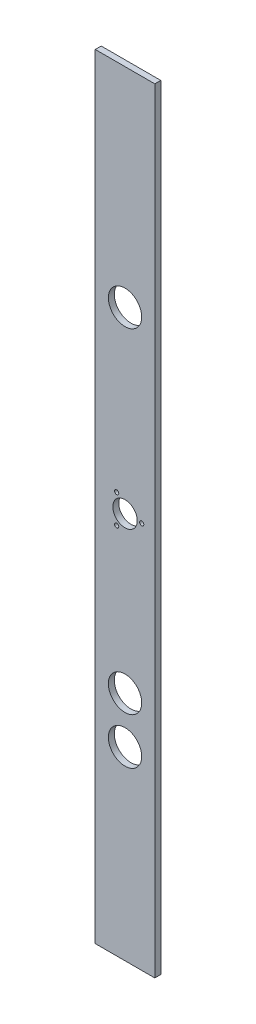
ISO-10303-21;
HEADER;
FILE_DESCRIPTION(('STEP AP214'),'2;1');
FILE_NAME('part.step','',(''),(''),'','','');
FILE_SCHEMA(('AUTOMOTIVE_DESIGN { 1 0 10303 214 1 1 1 1 }'));
ENDSEC;
DATA;
#1=APPLICATION_CONTEXT('core data for automotive mechanical design processes');
#2=APPLICATION_PROTOCOL_DEFINITION('international standard','automotive_design',2000,#1);
#3=PRODUCT_CONTEXT('',#1,'mechanical');
#4=PRODUCT('Part','Part','',(#3));
#5=PRODUCT_RELATED_PRODUCT_CATEGORY('part','',(#4));
#6=PRODUCT_DEFINITION_FORMATION('','',#4);
#7=PRODUCT_DEFINITION_CONTEXT('part definition',#1,'design');
#8=PRODUCT_DEFINITION('design','',#6,#7);
#9=PRODUCT_DEFINITION_SHAPE('','',#8);
#10=(LENGTH_UNIT() NAMED_UNIT(*) SI_UNIT(.MILLI.,.METRE.));
#11=(NAMED_UNIT(*) PLANE_ANGLE_UNIT() SI_UNIT($,.RADIAN.));
#12=(NAMED_UNIT(*) SI_UNIT($,.STERADIAN.) SOLID_ANGLE_UNIT());
#13=UNCERTAINTY_MEASURE_WITH_UNIT(LENGTH_MEASURE(1.E-05),#10,'distance_accuracy_value','');
#14=(GEOMETRIC_REPRESENTATION_CONTEXT(3) GLOBAL_UNCERTAINTY_ASSIGNED_CONTEXT((#13)) GLOBAL_UNIT_ASSIGNED_CONTEXT((#10,
#11,#12)) REPRESENTATION_CONTEXT('',''));
#15=CARTESIAN_POINT('',(0.,0.,0.));
#16=DIRECTION('',(0.,0.,1.));
#17=DIRECTION('',(1.,0.,0.));
#18=AXIS2_PLACEMENT_3D('',#15,#16,#17);
#19=CARTESIAN_POINT('',(50.,0.,5.));
#20=DIRECTION('',(1.,0.,0.));
#21=DIRECTION('',(0.,1.,0.));
#22=AXIS2_PLACEMENT_3D('',#19,#20,#21);
#23=PLANE('',#22);
#24=DIRECTION('',(0.,-1.,0.));
#25=VECTOR('',#24,1.);
#26=CARTESIAN_POINT('',(50.,0.,0.));
#27=LINE('',#26,#25);
#28=CARTESIAN_POINT('',(50.,0.,0.));
#29=VERTEX_POINT('',#28);
#30=CARTESIAN_POINT('',(50.0000000000001,-650.,0.));
#31=VERTEX_POINT('',#30);
#32=EDGE_CURVE('E118',#29,#31,#27,.T.);
#33=ORIENTED_EDGE('',*,*,#32,.F.);
#34=DIRECTION('',(0.,0.,-1.));
#35=VECTOR('',#34,1.);
#36=CARTESIAN_POINT('',(50.,0.,5.));
#37=LINE('',#36,#35);
#38=CARTESIAN_POINT('',(50.,0.,5.));
#39=VERTEX_POINT('',#38);
#40=EDGE_CURVE('E78',#39,#29,#37,.T.);
#41=ORIENTED_EDGE('',*,*,#40,.F.);
#42=DIRECTION('',(0.,-1.,0.));
#43=VECTOR('',#42,1.);
#44=CARTESIAN_POINT('',(50.,0.,5.));
#45=LINE('',#44,#43);
#46=CARTESIAN_POINT('',(50.0000000000001,-650.,5.));
#47=VERTEX_POINT('',#46);
#48=EDGE_CURVE('E99',#39,#47,#45,.T.);
#49=ORIENTED_EDGE('',*,*,#48,.T.);
#50=DIRECTION('',(0.,0.,-1.));
#51=VECTOR('',#50,1.);
#52=CARTESIAN_POINT('',(50.0000000000001,-650.,5.));
#53=LINE('',#52,#51);
#54=EDGE_CURVE('E75',#47,#31,#53,.T.);
#55=ORIENTED_EDGE('',*,*,#54,.T.);
#56=EDGE_LOOP('',(#33,#41,#49,#55));
#57=FACE_BOUND('',#56,.T.);
#58=ADVANCED_FACE('F34',(#57),#23,.T.);
#59=CARTESIAN_POINT('',(0.,0.,5.));
#60=DIRECTION('',(0.,1.,0.));
#61=DIRECTION('',(0.,0.,1.));
#62=AXIS2_PLACEMENT_3D('',#59,#60,#61);
#63=PLANE('',#62);
#64=DIRECTION('',(1.,0.,0.));
#65=VECTOR('',#64,1.);
#66=CARTESIAN_POINT('',(0.,0.,0.));
#67=LINE('',#66,#65);
#68=CARTESIAN_POINT('',(0.,0.,0.));
#69=VERTEX_POINT('',#68);
#70=EDGE_CURVE('E89',#69,#29,#67,.T.);
#71=ORIENTED_EDGE('',*,*,#70,.F.);
#72=DIRECTION('',(0.,0.,-1.));
#73=VECTOR('',#72,1.);
#74=CARTESIAN_POINT('',(0.,0.,5.));
#75=LINE('',#74,#73);
#76=CARTESIAN_POINT('',(0.,0.,5.));
#77=VERTEX_POINT('',#76);
#78=EDGE_CURVE('E83',#77,#69,#75,.T.);
#79=ORIENTED_EDGE('',*,*,#78,.F.);
#80=DIRECTION('',(1.,0.,0.));
#81=VECTOR('',#80,1.);
#82=CARTESIAN_POINT('',(0.,0.,5.));
#83=LINE('',#82,#81);
#84=EDGE_CURVE('E87',#77,#39,#83,.T.);
#85=ORIENTED_EDGE('',*,*,#84,.T.);
#86=ORIENTED_EDGE('',*,*,#40,.T.);
#87=EDGE_LOOP('',(#71,#79,#85,#86));
#88=FACE_BOUND('',#87,.T.);
#89=ADVANCED_FACE('F85',(#88),#63,.T.);
#90=CARTESIAN_POINT('',(0.,0.,5.));
#91=DIRECTION('',(1.,0.,0.));
#92=DIRECTION('',(0.,1.,0.));
#93=AXIS2_PLACEMENT_3D('',#90,#91,#92);
#94=PLANE('',#93);
#95=DIRECTION('',(0.,-1.,0.));
#96=VECTOR('',#95,1.);
#97=CARTESIAN_POINT('',(0.,0.,0.));
#98=LINE('',#97,#96);
#99=CARTESIAN_POINT('',(0.,-650.,0.));
#100=VERTEX_POINT('',#99);
#101=EDGE_CURVE('E121',#69,#100,#98,.T.);
#102=ORIENTED_EDGE('',*,*,#101,.T.);
#103=DIRECTION('',(0.,0.,-1.));
#104=VECTOR('',#103,1.);
#105=CARTESIAN_POINT('',(0.,-650.,5.));
#106=LINE('',#105,#104);
#107=CARTESIAN_POINT('',(0.,-650.,5.));
#108=VERTEX_POINT('',#107);
#109=EDGE_CURVE('E92',#108,#100,#106,.T.);
#110=ORIENTED_EDGE('',*,*,#109,.F.);
#111=DIRECTION('',(0.,-1.,0.));
#112=VECTOR('',#111,1.);
#113=CARTESIAN_POINT('',(0.,0.,5.));
#114=LINE('',#113,#112);
#115=EDGE_CURVE('E95',#77,#108,#114,.T.);
#116=ORIENTED_EDGE('',*,*,#115,.F.);
#117=ORIENTED_EDGE('',*,*,#78,.T.);
#118=EDGE_LOOP('',(#102,#110,#116,#117));
#119=FACE_BOUND('',#118,.T.);
#120=ADVANCED_FACE('F96',(#119),#94,.F.);
#121=CARTESIAN_POINT('',(25.,-494.5,5.));
#122=DIRECTION('',(0.,0.,-1.));
#123=DIRECTION('',(-1.,0.,0.));
#124=AXIS2_PLACEMENT_3D('',#121,#122,#123);
#125=CYLINDRICAL_SURFACE('',#124,14.);
#126=CARTESIAN_POINT('',(25.,-494.5,5.));
#127=DIRECTION('',(0.,0.,1.));
#128=DIRECTION('',(1.,0.,0.));
#129=AXIS2_PLACEMENT_3D('',#126,#127,#128);
#130=CIRCLE('',#129,14.);
#131=CARTESIAN_POINT('',(39.,-494.5,5.));
#132=VERTEX_POINT('',#131);
#133=EDGE_CURVE('E101',#132,#132,#130,.T.);
#134=ORIENTED_EDGE('',*,*,#133,.T.);
#135=EDGE_LOOP('',(#134));
#136=FACE_BOUND('',#135,.T.);
#137=CARTESIAN_POINT('',(25.,-494.5,0.));
#138=DIRECTION('',(0.,0.,1.));
#139=DIRECTION('',(1.,0.,0.));
#140=AXIS2_PLACEMENT_3D('',#137,#138,#139);
#141=CIRCLE('',#140,14.);
#142=CARTESIAN_POINT('',(39.,-494.5,0.));
#143=VERTEX_POINT('',#142);
#144=EDGE_CURVE('E115',#143,#143,#141,.T.);
#145=ORIENTED_EDGE('',*,*,#144,.F.);
#146=EDGE_LOOP('',(#145));
#147=FACE_BOUND('',#146,.T.);
#148=ADVANCED_FACE('F173',(#136,#147),#125,.F.);
#149=CARTESIAN_POINT('',(18.,-312.875644347018,5.));
#150=DIRECTION('',(0.,0.,-1.));
#151=DIRECTION('',(-1.,0.,0.));
#152=AXIS2_PLACEMENT_3D('',#149,#150,#151);
#153=CYLINDRICAL_SURFACE('',#152,1.75000000000001);
#154=CARTESIAN_POINT('',(18.,-312.875644347018,1.00000000000001));
#155=DIRECTION('',(0.,0.,1.));
#156=DIRECTION('',(1.,0.,0.));
#157=AXIS2_PLACEMENT_3D('',#154,#155,#156);
#158=CIRCLE('',#157,1.75000000000001);
#159=CARTESIAN_POINT('',(19.75,-312.875644347018,1.00000000000001));
#160=VERTEX_POINT('',#159);
#161=EDGE_CURVE('E43',#160,#160,#158,.F.);
#162=ORIENTED_EDGE('',*,*,#161,.T.);
#163=EDGE_LOOP('',(#162));
#164=FACE_BOUND('',#163,.T.);
#165=CARTESIAN_POINT('',(18.,-312.875644347018,5.));
#166=DIRECTION('',(0.,0.,1.));
#167=DIRECTION('',(1.,0.,0.));
#168=AXIS2_PLACEMENT_3D('',#165,#166,#167);
#169=CIRCLE('',#168,1.75000000000001);
#170=CARTESIAN_POINT('',(19.75,-312.875644347018,5.));
#171=VERTEX_POINT('',#170);
#172=EDGE_CURVE('E225',#171,#171,#169,.T.);
#173=ORIENTED_EDGE('',*,*,#172,.T.);
#174=EDGE_LOOP('',(#173));
#175=FACE_BOUND('',#174,.T.);
#176=ADVANCED_FACE('F142',(#164,#175),#153,.F.);
#177=CARTESIAN_POINT('',(25.,-455.5,5.));
#178=DIRECTION('',(0.,0.,-1.));
#179=DIRECTION('',(-1.,0.,0.));
#180=AXIS2_PLACEMENT_3D('',#177,#178,#179);
#181=CYLINDRICAL_SURFACE('',#180,14.);
#182=CARTESIAN_POINT('',(25.,-455.5,5.));
#183=DIRECTION('',(0.,0.,1.));
#184=DIRECTION('',(1.,0.,0.));
#185=AXIS2_PLACEMENT_3D('',#182,#183,#184);
#186=CIRCLE('',#185,14.);
#187=CARTESIAN_POINT('',(39.0000000000001,-455.5,5.));
#188=VERTEX_POINT('',#187);
#189=EDGE_CURVE('E222',#188,#188,#186,.T.);
#190=ORIENTED_EDGE('',*,*,#189,.T.);
#191=EDGE_LOOP('',(#190));
#192=FACE_BOUND('',#191,.T.);
#193=CARTESIAN_POINT('',(25.,-455.5,0.));
#194=DIRECTION('',(0.,0.,1.));
#195=DIRECTION('',(1.,0.,0.));
#196=AXIS2_PLACEMENT_3D('',#193,#194,#195);
#197=CIRCLE('',#196,14.);
#198=CARTESIAN_POINT('',(39.0000000000001,-455.5,0.));
#199=VERTEX_POINT('',#198);
#200=EDGE_CURVE('E112',#199,#199,#197,.T.);
#201=ORIENTED_EDGE('',*,*,#200,.F.);
#202=EDGE_LOOP('',(#201));
#203=FACE_BOUND('',#202,.T.);
#204=ADVANCED_FACE('F179',(#192,#203),#181,.F.);
#205=CARTESIAN_POINT('',(25.,-175.,5.));
#206=DIRECTION('',(0.,0.,-1.));
#207=DIRECTION('',(-1.,0.,0.));
#208=AXIS2_PLACEMENT_3D('',#205,#206,#207);
#209=CYLINDRICAL_SURFACE('',#208,14.);
#210=CARTESIAN_POINT('',(25.,-175.,5.));
#211=DIRECTION('',(0.,0.,1.));
#212=DIRECTION('',(1.,0.,0.));
#213=AXIS2_PLACEMENT_3D('',#210,#211,#212);
#214=CIRCLE('',#213,14.);
#215=CARTESIAN_POINT('',(39.0000000000001,-175.,5.));
#216=VERTEX_POINT('',#215);
#217=EDGE_CURVE('E219',#216,#216,#214,.T.);
#218=ORIENTED_EDGE('',*,*,#217,.T.);
#219=EDGE_LOOP('',(#218));
#220=FACE_BOUND('',#219,.T.);
#221=CARTESIAN_POINT('',(25.,-175.,0.));
#222=DIRECTION('',(0.,0.,1.));
#223=DIRECTION('',(1.,0.,0.));
#224=AXIS2_PLACEMENT_3D('',#221,#222,#223);
#225=CIRCLE('',#224,14.);
#226=CARTESIAN_POINT('',(39.0000000000001,-175.,0.));
#227=VERTEX_POINT('',#226);
#228=EDGE_CURVE('E109',#227,#227,#225,.T.);
#229=ORIENTED_EDGE('',*,*,#228,.F.);
#230=EDGE_LOOP('',(#229));
#231=FACE_BOUND('',#230,.T.);
#232=ADVANCED_FACE('F182',(#220,#231),#209,.F.);
#233=CARTESIAN_POINT('',(39.,-325.,5.));
#234=DIRECTION('',(0.,0.,-1.));
#235=DIRECTION('',(-1.,0.,0.));
#236=AXIS2_PLACEMENT_3D('',#233,#234,#235);
#237=CYLINDRICAL_SURFACE('',#236,1.75000000000002);
#238=CARTESIAN_POINT('',(39.,-325.,1.00000000000005));
#239=DIRECTION('',(0.,0.,1.));
#240=DIRECTION('',(1.,0.,0.));
#241=AXIS2_PLACEMENT_3D('',#238,#239,#240);
#242=CIRCLE('',#241,1.75000000000002);
#243=CARTESIAN_POINT('',(40.7500000000001,-325.,1.00000000000005));
#244=VERTEX_POINT('',#243);
#245=EDGE_CURVE('E11',#244,#244,#242,.F.);
#246=ORIENTED_EDGE('',*,*,#245,.T.);
#247=EDGE_LOOP('',(#246));
#248=FACE_BOUND('',#247,.T.);
#249=CARTESIAN_POINT('',(39.,-325.,5.));
#250=DIRECTION('',(0.,0.,1.));
#251=DIRECTION('',(1.,0.,0.));
#252=AXIS2_PLACEMENT_3D('',#249,#250,#251);
#253=CIRCLE('',#252,1.75000000000002);
#254=CARTESIAN_POINT('',(40.7500000000001,-325.,5.));
#255=VERTEX_POINT('',#254);
#256=EDGE_CURVE('E214',#255,#255,#253,.T.);
#257=ORIENTED_EDGE('',*,*,#256,.T.);
#258=EDGE_LOOP('',(#257));
#259=FACE_BOUND('',#258,.T.);
#260=ADVANCED_FACE('F186',(#248,#259),#237,.F.);
#261=CARTESIAN_POINT('',(25.,-325.,5.));
#262=DIRECTION('',(0.,0.,-1.));
#263=DIRECTION('',(-1.,0.,0.));
#264=AXIS2_PLACEMENT_3D('',#261,#262,#263);
#265=CYLINDRICAL_SURFACE('',#264,10.25);
#266=CARTESIAN_POINT('',(25.,-325.,5.));
#267=DIRECTION('',(0.,0.,1.));
#268=DIRECTION('',(1.,0.,0.));
#269=AXIS2_PLACEMENT_3D('',#266,#267,#268);
#270=CIRCLE('',#269,10.25);
#271=CARTESIAN_POINT('',(35.25,-325.,5.));
#272=VERTEX_POINT('',#271);
#273=EDGE_CURVE('E211',#272,#272,#270,.T.);
#274=ORIENTED_EDGE('',*,*,#273,.T.);
#275=EDGE_LOOP('',(#274));
#276=FACE_BOUND('',#275,.T.);
#277=CARTESIAN_POINT('',(25.,-325.,0.));
#278=DIRECTION('',(0.,0.,1.));
#279=DIRECTION('',(1.,0.,0.));
#280=AXIS2_PLACEMENT_3D('',#277,#278,#279);
#281=CIRCLE('',#280,10.25);
#282=CARTESIAN_POINT('',(35.25,-325.,0.));
#283=VERTEX_POINT('',#282);
#284=EDGE_CURVE('E106',#283,#283,#281,.T.);
#285=ORIENTED_EDGE('',*,*,#284,.F.);
#286=EDGE_LOOP('',(#285));
#287=FACE_BOUND('',#286,.T.);
#288=ADVANCED_FACE('F190',(#276,#287),#265,.F.);
#289=CARTESIAN_POINT('',(18.,-337.124355652982,5.));
#290=DIRECTION('',(0.,0.,-1.));
#291=DIRECTION('',(-1.,0.,0.));
#292=AXIS2_PLACEMENT_3D('',#289,#290,#291);
#293=CYLINDRICAL_SURFACE('',#292,1.75);
#294=CARTESIAN_POINT('',(18.,-337.124355652982,1.00000000000002));
#295=DIRECTION('',(0.,0.,1.));
#296=DIRECTION('',(1.,0.,0.));
#297=AXIS2_PLACEMENT_3D('',#294,#295,#296);
#298=CIRCLE('',#297,1.75);
#299=CARTESIAN_POINT('',(19.75,-337.124355652982,1.00000000000002));
#300=VERTEX_POINT('',#299);
#301=EDGE_CURVE('E137',#300,#300,#298,.F.);
#302=ORIENTED_EDGE('',*,*,#301,.T.);
#303=EDGE_LOOP('',(#302));
#304=FACE_BOUND('',#303,.T.);
#305=CARTESIAN_POINT('',(18.,-337.124355652982,5.));
#306=DIRECTION('',(0.,0.,1.));
#307=DIRECTION('',(1.,0.,0.));
#308=AXIS2_PLACEMENT_3D('',#305,#306,#307);
#309=CIRCLE('',#308,1.75);
#310=CARTESIAN_POINT('',(19.75,-337.124355652982,5.));
#311=VERTEX_POINT('',#310);
#312=EDGE_CURVE('E124',#311,#311,#309,.T.);
#313=ORIENTED_EDGE('',*,*,#312,.T.);
#314=EDGE_LOOP('',(#313));
#315=FACE_BOUND('',#314,.T.);
#316=ADVANCED_FACE('F194',(#304,#315),#293,.F.);
#317=CARTESIAN_POINT('',(0.,-650.,5.));
#318=DIRECTION('',(0.,1.,0.));
#319=DIRECTION('',(0.,0.,1.));
#320=AXIS2_PLACEMENT_3D('',#317,#318,#319);
#321=PLANE('',#320);
#322=DIRECTION('',(1.,0.,0.));
#323=VECTOR('',#322,1.);
#324=CARTESIAN_POINT('',(0.,-650.,0.));
#325=LINE('',#324,#323);
#326=EDGE_CURVE('E68',#100,#31,#325,.T.);
#327=ORIENTED_EDGE('',*,*,#326,.T.);
#328=ORIENTED_EDGE('',*,*,#54,.F.);
#329=DIRECTION('',(1.,0.,0.));
#330=VECTOR('',#329,1.);
#331=CARTESIAN_POINT('',(0.,-650.,5.));
#332=LINE('',#331,#330);
#333=EDGE_CURVE('E51',#108,#47,#332,.T.);
#334=ORIENTED_EDGE('',*,*,#333,.F.);
#335=ORIENTED_EDGE('',*,*,#109,.T.);
#336=EDGE_LOOP('',(#327,#328,#334,#335));
#337=FACE_BOUND('',#336,.T.);
#338=ADVANCED_FACE('F198',(#337),#321,.F.);
#339=CARTESIAN_POINT('',(0.,0.,5.));
#340=DIRECTION('',(0.,0.,1.));
#341=DIRECTION('',(1.,0.,0.));
#342=AXIS2_PLACEMENT_3D('',#339,#340,#341);
#343=PLANE('',#342);
#344=ORIENTED_EDGE('',*,*,#312,.F.);
#345=EDGE_LOOP('',(#344));
#346=FACE_BOUND('',#345,.T.);
#347=ORIENTED_EDGE('',*,*,#273,.F.);
#348=EDGE_LOOP('',(#347));
#349=FACE_BOUND('',#348,.T.);
#350=ORIENTED_EDGE('',*,*,#256,.F.);
#351=EDGE_LOOP('',(#350));
#352=FACE_BOUND('',#351,.T.);
#353=ORIENTED_EDGE('',*,*,#217,.F.);
#354=EDGE_LOOP('',(#353));
#355=FACE_BOUND('',#354,.T.);
#356=ORIENTED_EDGE('',*,*,#189,.F.);
#357=EDGE_LOOP('',(#356));
#358=FACE_BOUND('',#357,.T.);
#359=ORIENTED_EDGE('',*,*,#172,.F.);
#360=EDGE_LOOP('',(#359));
#361=FACE_BOUND('',#360,.T.);
#362=ORIENTED_EDGE('',*,*,#133,.F.);
#363=EDGE_LOOP('',(#362));
#364=FACE_BOUND('',#363,.T.);
#365=ORIENTED_EDGE('',*,*,#48,.F.);
#366=ORIENTED_EDGE('',*,*,#84,.F.);
#367=ORIENTED_EDGE('',*,*,#115,.T.);
#368=ORIENTED_EDGE('',*,*,#333,.T.);
#369=EDGE_LOOP('',(#365,#366,#367,#368));
#370=FACE_BOUND('',#369,.T.);
#371=ADVANCED_FACE('F98',(#346,#349,#352,#355,#358,#361,#364,#370),#343,.T.);
#372=CARTESIAN_POINT('',(0.,0.,0.));
#373=DIRECTION('',(0.,0.,1.));
#374=DIRECTION('',(1.,0.,0.));
#375=AXIS2_PLACEMENT_3D('',#372,#373,#374);
#376=PLANE('',#375);
#377=CARTESIAN_POINT('',(18.,-337.124355652982,0.));
#378=DIRECTION('',(0.,0.,1.));
#379=DIRECTION('',(1.,0.,0.));
#380=AXIS2_PLACEMENT_3D('',#377,#378,#379);
#381=CIRCLE('',#380,2.75000000000003);
#382=CARTESIAN_POINT('',(20.75,-337.124355652982,0.));
#383=VERTEX_POINT('',#382);
#384=EDGE_CURVE('E134',#383,#383,#381,.T.);
#385=ORIENTED_EDGE('',*,*,#384,.T.);
#386=EDGE_LOOP('',(#385));
#387=FACE_BOUND('',#386,.T.);
#388=CARTESIAN_POINT('',(18.,-312.875644347018,0.));
#389=DIRECTION('',(0.,0.,1.));
#390=DIRECTION('',(1.,0.,0.));
#391=AXIS2_PLACEMENT_3D('',#388,#389,#390);
#392=CIRCLE('',#391,2.75000000000003);
#393=CARTESIAN_POINT('',(20.75,-312.875644347018,0.));
#394=VERTEX_POINT('',#393);
#395=EDGE_CURVE('E131',#394,#394,#392,.T.);
#396=ORIENTED_EDGE('',*,*,#395,.T.);
#397=EDGE_LOOP('',(#396));
#398=FACE_BOUND('',#397,.T.);
#399=CARTESIAN_POINT('',(39.,-325.,0.));
#400=DIRECTION('',(0.,0.,1.));
#401=DIRECTION('',(1.,0.,0.));
#402=AXIS2_PLACEMENT_3D('',#399,#400,#401);
#403=CIRCLE('',#402,2.75000000000009);
#404=CARTESIAN_POINT('',(41.7500000000001,-325.,0.));
#405=VERTEX_POINT('',#404);
#406=EDGE_CURVE('E128',#405,#405,#403,.T.);
#407=ORIENTED_EDGE('',*,*,#406,.T.);
#408=EDGE_LOOP('',(#407));
#409=FACE_BOUND('',#408,.T.);
#410=ORIENTED_EDGE('',*,*,#284,.T.);
#411=EDGE_LOOP('',(#410));
#412=FACE_BOUND('',#411,.T.);
#413=ORIENTED_EDGE('',*,*,#228,.T.);
#414=EDGE_LOOP('',(#413));
#415=FACE_BOUND('',#414,.T.);
#416=ORIENTED_EDGE('',*,*,#200,.T.);
#417=EDGE_LOOP('',(#416));
#418=FACE_BOUND('',#417,.T.);
#419=ORIENTED_EDGE('',*,*,#144,.T.);
#420=EDGE_LOOP('',(#419));
#421=FACE_BOUND('',#420,.T.);
#422=ORIENTED_EDGE('',*,*,#32,.T.);
#423=ORIENTED_EDGE('',*,*,#326,.F.);
#424=ORIENTED_EDGE('',*,*,#101,.F.);
#425=ORIENTED_EDGE('',*,*,#70,.T.);
#426=EDGE_LOOP('',(#422,#423,#424,#425));
#427=FACE_BOUND('',#426,.T.);
#428=ADVANCED_FACE('F151',(#387,#398,#409,#412,#415,#418,#421,#427),#376,.F.);
#429=CARTESIAN_POINT('',(18.,-337.124355652982,0.));
#430=DIRECTION('',(0.,0.,-1.));
#431=DIRECTION('',(-1.,0.,0.));
#432=AXIS2_PLACEMENT_3D('',#429,#430,#431);
#433=CONICAL_SURFACE('',#432,2.75000000000003,0.785398163397451);
#434=ORIENTED_EDGE('',*,*,#301,.F.);
#435=EDGE_LOOP('',(#434));
#436=FACE_BOUND('',#435,.T.);
#437=ORIENTED_EDGE('',*,*,#384,.F.);
#438=EDGE_LOOP('',(#437));
#439=FACE_BOUND('',#438,.T.);
#440=ADVANCED_FACE('F148',(#436,#439),#433,.F.);
#441=CARTESIAN_POINT('',(18.,-312.875644347018,0.));
#442=DIRECTION('',(0.,0.,-1.));
#443=DIRECTION('',(-1.,0.,0.));
#444=AXIS2_PLACEMENT_3D('',#441,#442,#443);
#445=CONICAL_SURFACE('',#444,2.75000000000003,0.78539816339745);
#446=ORIENTED_EDGE('',*,*,#161,.F.);
#447=EDGE_LOOP('',(#446));
#448=FACE_BOUND('',#447,.T.);
#449=ORIENTED_EDGE('',*,*,#395,.F.);
#450=EDGE_LOOP('',(#449));
#451=FACE_BOUND('',#450,.T.);
#452=ADVANCED_FACE('F145',(#448,#451),#445,.F.);
#453=CARTESIAN_POINT('',(39.,-325.,0.));
#454=DIRECTION('',(0.,0.,-1.));
#455=DIRECTION('',(-1.,0.,0.));
#456=AXIS2_PLACEMENT_3D('',#453,#454,#455);
#457=CONICAL_SURFACE('',#456,2.75000000000009,0.785398163397457);
#458=ORIENTED_EDGE('',*,*,#245,.F.);
#459=EDGE_LOOP('',(#458));
#460=FACE_BOUND('',#459,.T.);
#461=ORIENTED_EDGE('',*,*,#406,.F.);
#462=EDGE_LOOP('',(#461));
#463=FACE_BOUND('',#462,.T.);
#464=ADVANCED_FACE('F36',(#460,#463),#457,.F.);
#465=CLOSED_SHELL('',(#58,#89,#120,#148,#176,#204,#232,#260,#288,#316,#338,#371,#428,#440,#452,#464));
#466=MANIFOLD_SOLID_BREP('B2',#465);
#467=ADVANCED_BREP_SHAPE_REPRESENTATION('',(#18,#466),#14);
#468=SHAPE_DEFINITION_REPRESENTATION(#9,#467);
ENDSEC;
END-ISO-10303-21;
